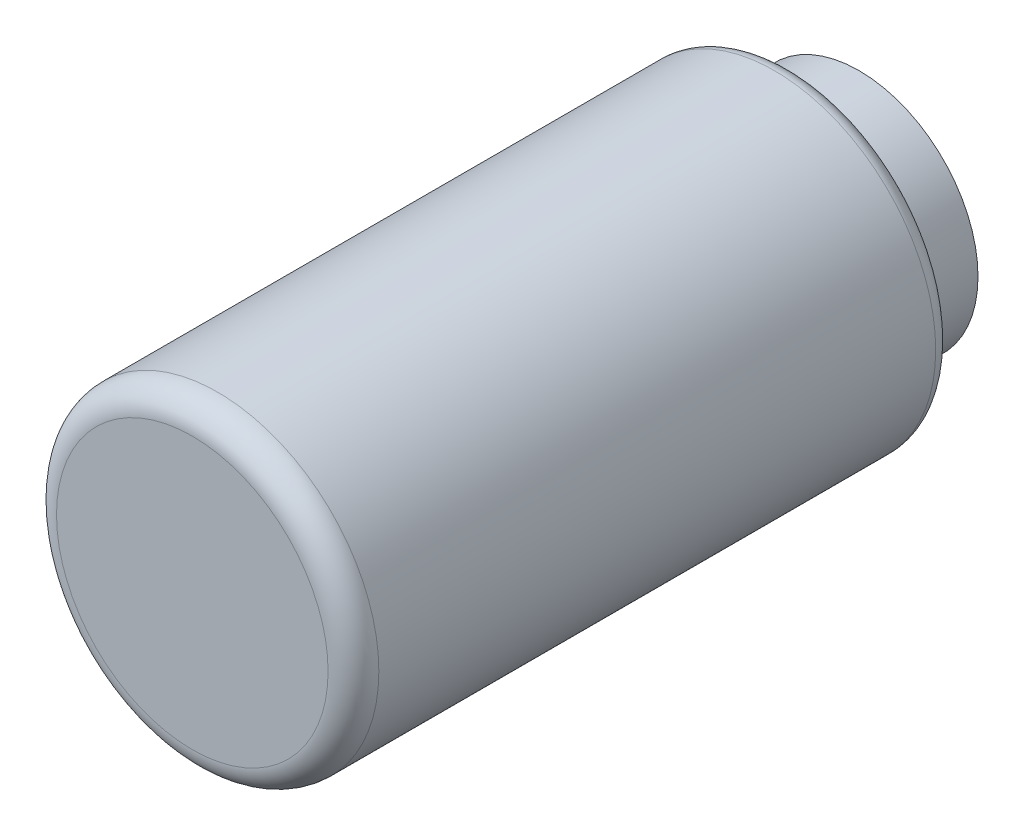
ISO-10303-21;
HEADER;
FILE_DESCRIPTION(('STEP AP214'),'2;1');
FILE_NAME('part.step','',(''),(''),'','','');
FILE_SCHEMA(('AUTOMOTIVE_DESIGN { 1 0 10303 214 1 1 1 1 }'));
ENDSEC;
DATA;
#1=APPLICATION_CONTEXT('core data for automotive mechanical design processes');
#2=APPLICATION_PROTOCOL_DEFINITION('international standard','automotive_design',2000,#1);
#3=PRODUCT_CONTEXT('',#1,'mechanical');
#4=PRODUCT('Part','Part','',(#3));
#5=PRODUCT_RELATED_PRODUCT_CATEGORY('part','',(#4));
#6=PRODUCT_DEFINITION_FORMATION('','',#4);
#7=PRODUCT_DEFINITION_CONTEXT('part definition',#1,'design');
#8=PRODUCT_DEFINITION('design','',#6,#7);
#9=PRODUCT_DEFINITION_SHAPE('','',#8);
#10=(LENGTH_UNIT() NAMED_UNIT(*) SI_UNIT(.MILLI.,.METRE.));
#11=(NAMED_UNIT(*) PLANE_ANGLE_UNIT() SI_UNIT($,.RADIAN.));
#12=(NAMED_UNIT(*) SI_UNIT($,.STERADIAN.) SOLID_ANGLE_UNIT());
#13=UNCERTAINTY_MEASURE_WITH_UNIT(LENGTH_MEASURE(1.E-05),#10,'distance_accuracy_value','');
#14=(GEOMETRIC_REPRESENTATION_CONTEXT(3) GLOBAL_UNCERTAINTY_ASSIGNED_CONTEXT((#13)) GLOBAL_UNIT_ASSIGNED_CONTEXT((#10,
#11,#12)) REPRESENTATION_CONTEXT('',''));
#15=CARTESIAN_POINT('',(0.,0.,0.));
#16=DIRECTION('',(0.,0.,1.));
#17=DIRECTION('',(1.,0.,0.));
#18=AXIS2_PLACEMENT_3D('',#15,#16,#17);
#19=CARTESIAN_POINT('',(19.05,0.,-72.82));
#20=DIRECTION('',(0.,0.,1.));
#21=DIRECTION('',(1.,0.,0.));
#22=AXIS2_PLACEMENT_3D('',#19,#20,#21);
#23=TOROIDAL_SURFACE('',#22,16.05,2.);
#24=CARTESIAN_POINT('',(19.05,0.,-70.82));
#25=DIRECTION('',(0.,0.,1.));
#26=DIRECTION('',(1.,0.,0.));
#27=AXIS2_PLACEMENT_3D('',#24,#25,#26);
#28=CIRCLE('',#27,16.05);
#29=CARTESIAN_POINT('',(35.1,0.,-70.82));
#30=VERTEX_POINT('',#29);
#31=EDGE_CURVE('E103',#30,#30,#28,.T.);
#32=ORIENTED_EDGE('',*,*,#31,.F.);
#33=EDGE_LOOP('',(#32));
#34=FACE_BOUND('',#33,.T.);
#35=CARTESIAN_POINT('',(19.05,0.,-72.82));
#36=DIRECTION('',(0.,0.,-1.));
#37=DIRECTION('',(1.,0.,0.));
#38=AXIS2_PLACEMENT_3D('',#35,#36,#37);
#39=CIRCLE('',#38,14.05);
#40=CARTESIAN_POINT('',(33.1,0.,-72.82));
#41=VERTEX_POINT('',#40);
#42=EDGE_CURVE('E88',#41,#41,#39,.T.);
#43=ORIENTED_EDGE('',*,*,#42,.F.);
#44=EDGE_LOOP('',(#43));
#45=FACE_BOUND('',#44,.T.);
#46=ADVANCED_FACE('F17',(#34,#45),#23,.F.);
#47=CARTESIAN_POINT('',(19.05,0.,-3.));
#48=DIRECTION('',(0.,0.,-1.));
#49=DIRECTION('',(-1.,0.,0.));
#50=AXIS2_PLACEMENT_3D('',#47,#48,#49);
#51=TOROIDAL_SURFACE('',#50,16.05,1.);
#52=CARTESIAN_POINT('',(19.05,0.,-2.));
#53=DIRECTION('',(0.,0.,1.));
#54=DIRECTION('',(-1.,0.,0.));
#55=AXIS2_PLACEMENT_3D('',#52,#53,#54);
#56=CIRCLE('',#55,16.05);
#57=CARTESIAN_POINT('',(2.99999999999996,0.,-2.));
#58=VERTEX_POINT('',#57);
#59=EDGE_CURVE('E102',#58,#58,#56,.T.);
#60=ORIENTED_EDGE('',*,*,#59,.T.);
#61=EDGE_LOOP('',(#60));
#62=FACE_BOUND('',#61,.T.);
#63=CARTESIAN_POINT('',(19.05,0.,-3.));
#64=DIRECTION('',(0.,0.,-1.));
#65=DIRECTION('',(-1.,0.,0.));
#66=AXIS2_PLACEMENT_3D('',#63,#64,#65);
#67=CIRCLE('',#66,17.05);
#68=CARTESIAN_POINT('',(1.99999999999996,0.,-3.));
#69=VERTEX_POINT('',#68);
#70=EDGE_CURVE('E11',#69,#69,#67,.T.);
#71=ORIENTED_EDGE('',*,*,#70,.T.);
#72=EDGE_LOOP('',(#71));
#73=FACE_BOUND('',#72,.T.);
#74=ADVANCED_FACE('F190',(#62,#73),#51,.F.);
#75=CARTESIAN_POINT('',(0.,0.,-68.82));
#76=DIRECTION('',(0.,0.,1.));
#77=DIRECTION('',(1.,0.,0.));
#78=AXIS2_PLACEMENT_3D('',#75,#76,#77);
#79=PLANE('',#78);
#80=CARTESIAN_POINT('',(19.05,0.,-68.82));
#81=DIRECTION('',(0.,0.,-1.));
#82=DIRECTION('',(1.,0.,0.));
#83=AXIS2_PLACEMENT_3D('',#80,#81,#82);
#84=CIRCLE('',#83,12.05);
#85=CARTESIAN_POINT('',(31.1,0.,-68.82));
#86=VERTEX_POINT('',#85);
#87=EDGE_CURVE('E99',#86,#86,#84,.T.);
#88=ORIENTED_EDGE('',*,*,#87,.T.);
#89=EDGE_LOOP('',(#88));
#90=FACE_BOUND('',#89,.T.);
#91=CARTESIAN_POINT('',(19.05,0.,-68.82));
#92=DIRECTION('',(0.,0.,-1.));
#93=DIRECTION('',(1.,0.,0.));
#94=AXIS2_PLACEMENT_3D('',#91,#92,#93);
#95=CIRCLE('',#94,17.05);
#96=CARTESIAN_POINT('',(36.1,0.,-68.82));
#97=VERTEX_POINT('',#96);
#98=EDGE_CURVE('E25',#97,#97,#95,.T.);
#99=ORIENTED_EDGE('',*,*,#98,.F.);
#100=EDGE_LOOP('',(#99));
#101=FACE_BOUND('',#100,.T.);
#102=ADVANCED_FACE('F194',(#90,#101),#79,.T.);
#103=CARTESIAN_POINT('',(19.05,0.,-78.82));
#104=DIRECTION('',(0.,0.,-1.));
#105=DIRECTION('',(-1.,0.,0.));
#106=AXIS2_PLACEMENT_3D('',#103,#104,#105);
#107=CYLINDRICAL_SURFACE('',#106,17.05);
#108=ORIENTED_EDGE('',*,*,#70,.F.);
#109=EDGE_LOOP('',(#108));
#110=FACE_BOUND('',#109,.T.);
#111=ORIENTED_EDGE('',*,*,#98,.T.);
#112=EDGE_LOOP('',(#111));
#113=FACE_BOUND('',#112,.T.);
#114=ADVANCED_FACE('F241',(#110,#113),#107,.F.);
#115=CARTESIAN_POINT('',(0.,0.,-2.));
#116=DIRECTION('',(0.,0.,-1.));
#117=DIRECTION('',(0.,-1.,0.));
#118=AXIS2_PLACEMENT_3D('',#115,#116,#117);
#119=PLANE('',#118);
#120=ORIENTED_EDGE('',*,*,#59,.F.);
#121=EDGE_LOOP('',(#120));
#122=FACE_BOUND('',#121,.T.);
#123=ADVANCED_FACE('F263',(#122),#119,.T.);
#124=CARTESIAN_POINT('',(19.05,0.,-78.82));
#125=DIRECTION('',(0.,0.,-1.));
#126=DIRECTION('',(-1.,0.,0.));
#127=AXIS2_PLACEMENT_3D('',#124,#125,#126);
#128=CYLINDRICAL_SURFACE('',#127,12.05);
#129=ORIENTED_EDGE('',*,*,#87,.F.);
#130=EDGE_LOOP('',(#129));
#131=FACE_BOUND('',#130,.T.);
#132=CARTESIAN_POINT('',(19.05,0.,-78.82));
#133=DIRECTION('',(0.,0.,-1.));
#134=DIRECTION('',(-1.,0.,0.));
#135=AXIS2_PLACEMENT_3D('',#132,#133,#134);
#136=CIRCLE('',#135,12.05);
#137=CARTESIAN_POINT('',(7.,0.,-78.82));
#138=VERTEX_POINT('',#137);
#139=EDGE_CURVE('E94',#138,#138,#136,.T.);
#140=ORIENTED_EDGE('',*,*,#139,.T.);
#141=EDGE_LOOP('',(#140));
#142=FACE_BOUND('',#141,.T.);
#143=ADVANCED_FACE('F205',(#131,#142),#128,.F.);
#144=CARTESIAN_POINT('',(19.05,0.,-3.));
#145=DIRECTION('',(0.,0.,-1.));
#146=DIRECTION('',(-1.,0.,0.));
#147=AXIS2_PLACEMENT_3D('',#144,#145,#146);
#148=TOROIDAL_SURFACE('',#147,16.05,3.);
#149=CARTESIAN_POINT('',(19.05,0.,0.));
#150=DIRECTION('',(0.,0.,1.));
#151=DIRECTION('',(-1.,0.,0.));
#152=AXIS2_PLACEMENT_3D('',#149,#150,#151);
#153=CIRCLE('',#152,16.05);
#154=CARTESIAN_POINT('',(2.99999999999996,0.,0.));
#155=VERTEX_POINT('',#154);
#156=EDGE_CURVE('E104',#155,#155,#153,.T.);
#157=ORIENTED_EDGE('',*,*,#156,.F.);
#158=EDGE_LOOP('',(#157));
#159=FACE_BOUND('',#158,.T.);
#160=CARTESIAN_POINT('',(19.05,0.,-3.));
#161=DIRECTION('',(0.,0.,-1.));
#162=DIRECTION('',(-1.,0.,0.));
#163=AXIS2_PLACEMENT_3D('',#160,#161,#162);
#164=CIRCLE('',#163,19.05);
#165=CARTESIAN_POINT('',(0.,0.,-3.));
#166=VERTEX_POINT('',#165);
#167=EDGE_CURVE('E112',#166,#166,#164,.T.);
#168=ORIENTED_EDGE('',*,*,#167,.F.);
#169=EDGE_LOOP('',(#168));
#170=FACE_BOUND('',#169,.T.);
#171=ADVANCED_FACE('F200',(#159,#170),#148,.T.);
#172=CARTESIAN_POINT('',(19.05,0.,-68.82));
#173=DIRECTION('',(0.,0.,1.));
#174=DIRECTION('',(1.,0.,0.));
#175=AXIS2_PLACEMENT_3D('',#172,#173,#174);
#176=TOROIDAL_SURFACE('',#175,17.05,2.);
#177=CARTESIAN_POINT('',(19.05,0.,-68.82));
#178=DIRECTION('',(0.,0.,1.));
#179=DIRECTION('',(1.,0.,0.));
#180=AXIS2_PLACEMENT_3D('',#177,#178,#179);
#181=CIRCLE('',#180,19.05);
#182=CARTESIAN_POINT('',(38.1,0.,-68.82));
#183=VERTEX_POINT('',#182);
#184=EDGE_CURVE('E106',#183,#183,#181,.T.);
#185=ORIENTED_EDGE('',*,*,#184,.F.);
#186=EDGE_LOOP('',(#185));
#187=FACE_BOUND('',#186,.T.);
#188=CARTESIAN_POINT('',(19.05,0.,-70.82));
#189=DIRECTION('',(0.,0.,-1.));
#190=DIRECTION('',(1.,0.,0.));
#191=AXIS2_PLACEMENT_3D('',#188,#189,#190);
#192=CIRCLE('',#191,17.05);
#193=CARTESIAN_POINT('',(36.1,0.,-70.82));
#194=VERTEX_POINT('',#193);
#195=EDGE_CURVE('E98',#194,#194,#192,.T.);
#196=ORIENTED_EDGE('',*,*,#195,.F.);
#197=EDGE_LOOP('',(#196));
#198=FACE_BOUND('',#197,.T.);
#199=ADVANCED_FACE('F204',(#187,#198),#176,.T.);
#200=CARTESIAN_POINT('',(0.,0.,-70.82));
#201=DIRECTION('',(0.,0.,1.));
#202=DIRECTION('',(1.,0.,0.));
#203=AXIS2_PLACEMENT_3D('',#200,#201,#202);
#204=PLANE('',#203);
#205=ORIENTED_EDGE('',*,*,#31,.T.);
#206=EDGE_LOOP('',(#205));
#207=FACE_BOUND('',#206,.T.);
#208=ORIENTED_EDGE('',*,*,#195,.T.);
#209=EDGE_LOOP('',(#208));
#210=FACE_BOUND('',#209,.T.);
#211=ADVANCED_FACE('F232',(#207,#210),#204,.F.);
#212=CARTESIAN_POINT('',(19.05,0.,-78.82));
#213=DIRECTION('',(0.,0.,-1.));
#214=DIRECTION('',(-1.,0.,0.));
#215=AXIS2_PLACEMENT_3D('',#212,#213,#214);
#216=CYLINDRICAL_SURFACE('',#215,19.05);
#217=ORIENTED_EDGE('',*,*,#167,.T.);
#218=EDGE_LOOP('',(#217));
#219=FACE_BOUND('',#218,.T.);
#220=ORIENTED_EDGE('',*,*,#184,.T.);
#221=EDGE_LOOP('',(#220));
#222=FACE_BOUND('',#221,.T.);
#223=ADVANCED_FACE('F223',(#219,#222),#216,.T.);
#224=CARTESIAN_POINT('',(0.,0.,0.));
#225=DIRECTION('',(0.,0.,-1.));
#226=DIRECTION('',(0.,-1.,0.));
#227=AXIS2_PLACEMENT_3D('',#224,#225,#226);
#228=PLANE('',#227);
#229=ORIENTED_EDGE('',*,*,#156,.T.);
#230=EDGE_LOOP('',(#229));
#231=FACE_BOUND('',#230,.T.);
#232=ADVANCED_FACE('F214',(#231),#228,.F.);
#233=CARTESIAN_POINT('',(0.,0.,-78.82));
#234=DIRECTION('',(0.,0.,-1.));
#235=DIRECTION('',(0.,-1.,0.));
#236=AXIS2_PLACEMENT_3D('',#233,#234,#235);
#237=PLANE('',#236);
#238=ORIENTED_EDGE('',*,*,#139,.F.);
#239=EDGE_LOOP('',(#238));
#240=FACE_BOUND('',#239,.T.);
#241=CARTESIAN_POINT('',(19.05,0.,-78.82));
#242=DIRECTION('',(0.,0.,-1.));
#243=DIRECTION('',(-1.,0.,0.));
#244=AXIS2_PLACEMENT_3D('',#241,#242,#243);
#245=CIRCLE('',#244,14.05);
#246=CARTESIAN_POINT('',(5.,0.,-78.82));
#247=VERTEX_POINT('',#246);
#248=EDGE_CURVE('E84',#247,#247,#245,.T.);
#249=ORIENTED_EDGE('',*,*,#248,.T.);
#250=EDGE_LOOP('',(#249));
#251=FACE_BOUND('',#250,.T.);
#252=ADVANCED_FACE('F85',(#240,#251),#237,.T.);
#253=CARTESIAN_POINT('',(19.05,0.,-78.82));
#254=DIRECTION('',(0.,0.,-1.));
#255=DIRECTION('',(-1.,0.,0.));
#256=AXIS2_PLACEMENT_3D('',#253,#254,#255);
#257=CYLINDRICAL_SURFACE('',#256,14.05);
#258=ORIENTED_EDGE('',*,*,#42,.T.);
#259=EDGE_LOOP('',(#258));
#260=FACE_BOUND('',#259,.T.);
#261=ORIENTED_EDGE('',*,*,#248,.F.);
#262=EDGE_LOOP('',(#261));
#263=FACE_BOUND('',#262,.T.);
#264=ADVANCED_FACE('F182',(#260,#263),#257,.T.);
#265=CLOSED_SHELL('',(#46,#74,#102,#114,#123,#143,#171,#199,#211,#223,#232,#252,#264));
#266=MANIFOLD_SOLID_BREP('B1',#265);
#267=ADVANCED_BREP_SHAPE_REPRESENTATION('',(#18,#266),#14);
#268=SHAPE_DEFINITION_REPRESENTATION(#9,#267);
ENDSEC;
END-ISO-10303-21;
